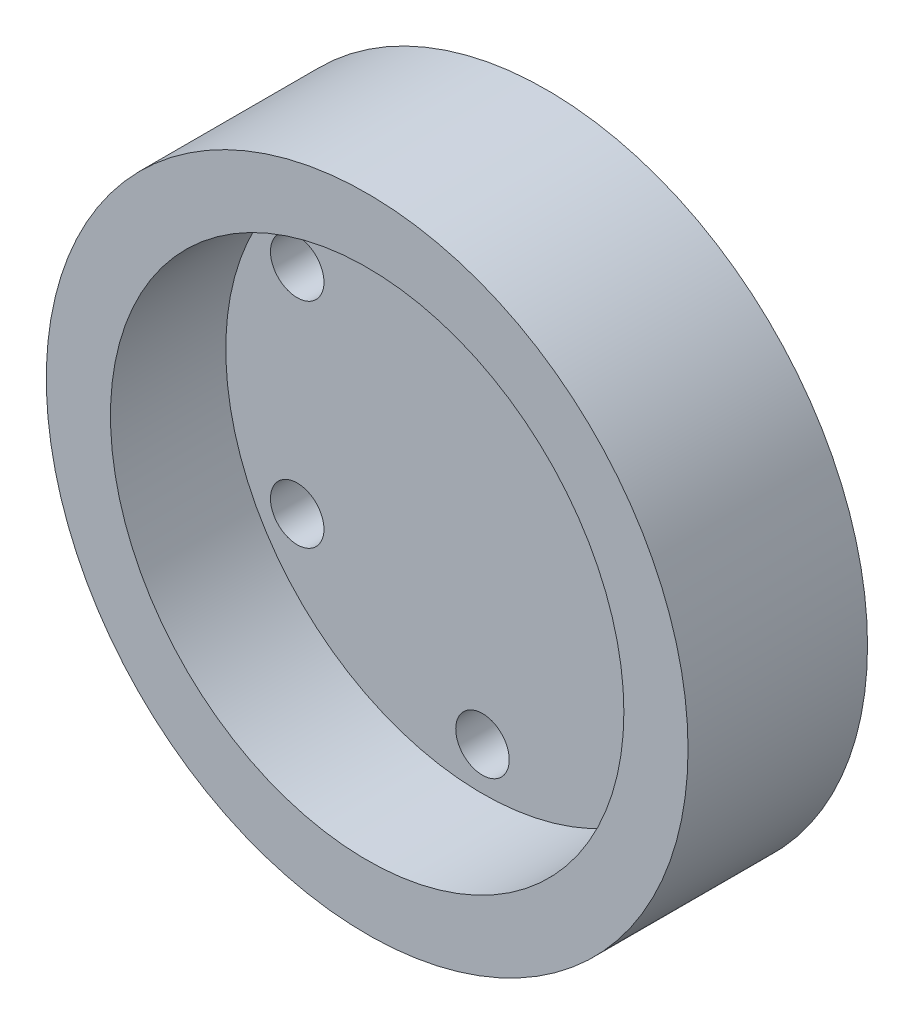
ISO-10303-21;
HEADER;
FILE_DESCRIPTION(('STEP AP214'),'2;1');
FILE_NAME('part.step','',(''),(''),'','','');
FILE_SCHEMA(('AUTOMOTIVE_DESIGN { 1 0 10303 214 1 1 1 1 }'));
ENDSEC;
DATA;
#1=APPLICATION_CONTEXT('core data for automotive mechanical design processes');
#2=APPLICATION_PROTOCOL_DEFINITION('international standard','automotive_design',2000,#1);
#3=PRODUCT_CONTEXT('',#1,'mechanical');
#4=PRODUCT('Part','Part','',(#3));
#5=PRODUCT_RELATED_PRODUCT_CATEGORY('part','',(#4));
#6=PRODUCT_DEFINITION_FORMATION('','',#4);
#7=PRODUCT_DEFINITION_CONTEXT('part definition',#1,'design');
#8=PRODUCT_DEFINITION('design','',#6,#7);
#9=PRODUCT_DEFINITION_SHAPE('','',#8);
#10=(LENGTH_UNIT() NAMED_UNIT(*) SI_UNIT(.MILLI.,.METRE.));
#11=(NAMED_UNIT(*) PLANE_ANGLE_UNIT() SI_UNIT($,.RADIAN.));
#12=(NAMED_UNIT(*) SI_UNIT($,.STERADIAN.) SOLID_ANGLE_UNIT());
#13=UNCERTAINTY_MEASURE_WITH_UNIT(LENGTH_MEASURE(1.E-05),#10,'distance_accuracy_value','');
#14=(GEOMETRIC_REPRESENTATION_CONTEXT(3) GLOBAL_UNCERTAINTY_ASSIGNED_CONTEXT((#13)) GLOBAL_UNIT_ASSIGNED_CONTEXT((#10,
#11,#12)) REPRESENTATION_CONTEXT('',''));
#15=CARTESIAN_POINT('',(0.,0.,0.));
#16=DIRECTION('',(0.,0.,1.));
#17=DIRECTION('',(1.,0.,0.));
#18=AXIS2_PLACEMENT_3D('',#15,#16,#17);
#19=CARTESIAN_POINT('',(0.,0.,5.79020268305852));
#20=DIRECTION('',(0.,0.,-1.));
#21=DIRECTION('',(-1.,0.,0.));
#22=AXIS2_PLACEMENT_3D('',#19,#20,#21);
#23=CYLINDRICAL_SURFACE('',#22,7.5);
#24=CARTESIAN_POINT('',(0.,0.,5.79020268305852));
#25=DIRECTION('',(0.,0.,1.));
#26=DIRECTION('',(1.,0.,0.));
#27=AXIS2_PLACEMENT_3D('',#24,#25,#26);
#28=CIRCLE('',#27,7.5);
#29=CARTESIAN_POINT('',(7.5,0.,5.79020268305852));
#30=VERTEX_POINT('',#29);
#31=EDGE_CURVE('E11',#30,#30,#28,.T.);
#32=ORIENTED_EDGE('',*,*,#31,.F.);
#33=EDGE_LOOP('',(#32));
#34=FACE_BOUND('',#33,.T.);
#35=CARTESIAN_POINT('',(0.,0.,1.59520268305852));
#36=DIRECTION('',(0.,0.,1.));
#37=DIRECTION('',(1.,0.,0.));
#38=AXIS2_PLACEMENT_3D('',#35,#36,#37);
#39=CIRCLE('',#38,7.5);
#40=CARTESIAN_POINT('',(7.5,0.,1.59520268305852));
#41=VERTEX_POINT('',#40);
#42=EDGE_CURVE('E51',#41,#41,#39,.T.);
#43=ORIENTED_EDGE('',*,*,#42,.T.);
#44=EDGE_LOOP('',(#43));
#45=FACE_BOUND('',#44,.T.);
#46=ADVANCED_FACE('F43',(#34,#45),#23,.T.);
#47=CARTESIAN_POINT('',(0.,0.,5.79020268305852));
#48=DIRECTION('',(0.,0.,1.));
#49=DIRECTION('',(1.,0.,0.));
#50=AXIS2_PLACEMENT_3D('',#47,#48,#49);
#51=PLANE('',#50);
#52=CARTESIAN_POINT('',(0.,0.,5.79020268305852));
#53=DIRECTION('',(0.,0.,1.));
#54=DIRECTION('',(1.,0.,0.));
#55=AXIS2_PLACEMENT_3D('',#52,#53,#54);
#56=CIRCLE('',#55,6.);
#57=CARTESIAN_POINT('',(6.,0.,5.79020268305852));
#58=VERTEX_POINT('',#57);
#59=EDGE_CURVE('E57',#58,#58,#56,.T.);
#60=ORIENTED_EDGE('',*,*,#59,.F.);
#61=EDGE_LOOP('',(#60));
#62=FACE_BOUND('',#61,.T.);
#63=ORIENTED_EDGE('',*,*,#31,.T.);
#64=EDGE_LOOP('',(#63));
#65=FACE_BOUND('',#64,.T.);
#66=ADVANCED_FACE('F125',(#62,#65),#51,.T.);
#67=CARTESIAN_POINT('',(0.,0.,1.59520268305852));
#68=DIRECTION('',(0.,0.,1.));
#69=DIRECTION('',(1.,0.,0.));
#70=AXIS2_PLACEMENT_3D('',#67,#68,#69);
#71=PLANE('',#70);
#72=CARTESIAN_POINT('',(0.,5.,1.59520268305852));
#73=DIRECTION('',(0.,0.,-1.));
#74=DIRECTION('',(-1.,0.,0.));
#75=AXIS2_PLACEMENT_3D('',#72,#73,#74);
#76=CIRCLE('',#75,0.625);
#77=CARTESIAN_POINT('',(-0.625,5.,1.59520268305852));
#78=VERTEX_POINT('',#77);
#79=EDGE_CURVE('E67',#78,#78,#76,.T.);
#80=ORIENTED_EDGE('',*,*,#79,.F.);
#81=EDGE_LOOP('',(#80));
#82=FACE_BOUND('',#81,.T.);
#83=CARTESIAN_POINT('',(4.33012701892216,2.50000000000005,1.59520268305852));
#84=DIRECTION('',(0.,0.,-1.));
#85=DIRECTION('',(-1.,0.,0.));
#86=AXIS2_PLACEMENT_3D('',#83,#84,#85);
#87=CIRCLE('',#86,0.625);
#88=CARTESIAN_POINT('',(3.70512701892216,2.50000000000005,1.59520268305852));
#89=VERTEX_POINT('',#88);
#90=EDGE_CURVE('E100',#89,#89,#87,.T.);
#91=ORIENTED_EDGE('',*,*,#90,.F.);
#92=EDGE_LOOP('',(#91));
#93=FACE_BOUND('',#92,.T.);
#94=CARTESIAN_POINT('',(4.33012701892221,-2.49999999999996,1.59520268305852));
#95=DIRECTION('',(0.,0.,-1.));
#96=DIRECTION('',(-1.,0.,0.));
#97=AXIS2_PLACEMENT_3D('',#94,#95,#96);
#98=CIRCLE('',#97,0.625);
#99=CARTESIAN_POINT('',(3.70512701892222,-2.49999999999996,1.59520268305852));
#100=VERTEX_POINT('',#99);
#101=EDGE_CURVE('E95',#100,#100,#98,.T.);
#102=ORIENTED_EDGE('',*,*,#101,.F.);
#103=EDGE_LOOP('',(#102));
#104=FACE_BOUND('',#103,.T.);
#105=CARTESIAN_POINT('',(0.,-5.,1.59520268305852));
#106=DIRECTION('',(0.,0.,-1.));
#107=DIRECTION('',(-1.,0.,0.));
#108=AXIS2_PLACEMENT_3D('',#105,#106,#107);
#109=CIRCLE('',#108,0.625);
#110=CARTESIAN_POINT('',(-0.624999999999965,-5.,1.59520268305852));
#111=VERTEX_POINT('',#110);
#112=EDGE_CURVE('E99',#111,#111,#109,.T.);
#113=ORIENTED_EDGE('',*,*,#112,.F.);
#114=EDGE_LOOP('',(#113));
#115=FACE_BOUND('',#114,.T.);
#116=CARTESIAN_POINT('',(-4.33012701892218,-2.50000000000002,1.59520268305852));
#117=DIRECTION('',(0.,0.,-1.));
#118=DIRECTION('',(-1.,0.,0.));
#119=AXIS2_PLACEMENT_3D('',#116,#117,#118);
#120=CIRCLE('',#119,0.625000000000001);
#121=CARTESIAN_POINT('',(-4.95512701892218,-2.50000000000002,1.59520268305852));
#122=VERTEX_POINT('',#121);
#123=EDGE_CURVE('E104',#122,#122,#120,.T.);
#124=ORIENTED_EDGE('',*,*,#123,.F.);
#125=EDGE_LOOP('',(#124));
#126=FACE_BOUND('',#125,.T.);
#127=CARTESIAN_POINT('',(-4.3301270189222,2.49999999999999,1.59520268305852));
#128=DIRECTION('',(0.,0.,-1.));
#129=DIRECTION('',(-1.,0.,0.));
#130=AXIS2_PLACEMENT_3D('',#127,#128,#129);
#131=CIRCLE('',#130,0.625);
#132=CARTESIAN_POINT('',(-4.9551270189222,2.49999999999999,1.59520268305852));
#133=VERTEX_POINT('',#132);
#134=EDGE_CURVE('E108',#133,#133,#131,.T.);
#135=ORIENTED_EDGE('',*,*,#134,.F.);
#136=EDGE_LOOP('',(#135));
#137=FACE_BOUND('',#136,.T.);
#138=ORIENTED_EDGE('',*,*,#42,.F.);
#139=EDGE_LOOP('',(#138));
#140=FACE_BOUND('',#139,.T.);
#141=ADVANCED_FACE('F121',(#82,#93,#104,#115,#126,#137,#140),#71,.F.);
#142=CARTESIAN_POINT('',(0.,0.,5.79020268305852));
#143=DIRECTION('',(0.,0.,-1.));
#144=DIRECTION('',(-1.,0.,0.));
#145=AXIS2_PLACEMENT_3D('',#142,#143,#144);
#146=CYLINDRICAL_SURFACE('',#145,6.);
#147=ORIENTED_EDGE('',*,*,#59,.T.);
#148=EDGE_LOOP('',(#147));
#149=FACE_BOUND('',#148,.T.);
#150=CARTESIAN_POINT('',(0.,0.,3.09520268305852));
#151=DIRECTION('',(0.,0.,1.));
#152=DIRECTION('',(1.,0.,0.));
#153=AXIS2_PLACEMENT_3D('',#150,#151,#152);
#154=CIRCLE('',#153,6.);
#155=CARTESIAN_POINT('',(6.,0.,3.09520268305852));
#156=VERTEX_POINT('',#155);
#157=EDGE_CURVE('E85',#156,#156,#154,.T.);
#158=ORIENTED_EDGE('',*,*,#157,.F.);
#159=EDGE_LOOP('',(#158));
#160=FACE_BOUND('',#159,.T.);
#161=ADVANCED_FACE('F124',(#149,#160),#146,.F.);
#162=CARTESIAN_POINT('',(0.,0.,3.09520268305852));
#163=DIRECTION('',(0.,0.,1.));
#164=DIRECTION('',(1.,0.,0.));
#165=AXIS2_PLACEMENT_3D('',#162,#163,#164);
#166=PLANE('',#165);
#167=CARTESIAN_POINT('',(0.,5.,3.09520268305852));
#168=DIRECTION('',(0.,0.,1.));
#169=DIRECTION('',(1.,0.,0.));
#170=AXIS2_PLACEMENT_3D('',#167,#168,#169);
#171=CIRCLE('',#170,0.625);
#172=CARTESIAN_POINT('',(0.625,5.,3.09520268305852));
#173=VERTEX_POINT('',#172);
#174=EDGE_CURVE('E46',#173,#173,#171,.T.);
#175=ORIENTED_EDGE('',*,*,#174,.F.);
#176=EDGE_LOOP('',(#175));
#177=FACE_BOUND('',#176,.T.);
#178=CARTESIAN_POINT('',(4.33012701892216,2.50000000000005,3.09520268305852));
#179=DIRECTION('',(0.,0.,1.));
#180=DIRECTION('',(1.,0.,0.));
#181=AXIS2_PLACEMENT_3D('',#178,#179,#180);
#182=CIRCLE('',#181,0.625);
#183=CARTESIAN_POINT('',(4.95512701892217,2.50000000000005,3.09520268305852));
#184=VERTEX_POINT('',#183);
#185=EDGE_CURVE('E78',#184,#184,#182,.T.);
#186=ORIENTED_EDGE('',*,*,#185,.F.);
#187=EDGE_LOOP('',(#186));
#188=FACE_BOUND('',#187,.T.);
#189=CARTESIAN_POINT('',(4.33012701892221,-2.49999999999996,3.09520268305852));
#190=DIRECTION('',(0.,0.,1.));
#191=DIRECTION('',(1.,0.,0.));
#192=AXIS2_PLACEMENT_3D('',#189,#190,#191);
#193=CIRCLE('',#192,0.625);
#194=CARTESIAN_POINT('',(4.95512701892221,-2.49999999999996,3.09520268305852));
#195=VERTEX_POINT('',#194);
#196=EDGE_CURVE('E75',#195,#195,#193,.T.);
#197=ORIENTED_EDGE('',*,*,#196,.F.);
#198=EDGE_LOOP('',(#197));
#199=FACE_BOUND('',#198,.T.);
#200=CARTESIAN_POINT('',(0.,-5.,3.09520268305852));
#201=DIRECTION('',(0.,0.,1.));
#202=DIRECTION('',(1.,0.,0.));
#203=AXIS2_PLACEMENT_3D('',#200,#201,#202);
#204=CIRCLE('',#203,0.625);
#205=CARTESIAN_POINT('',(0.625000000000035,-5.,3.09520268305852));
#206=VERTEX_POINT('',#205);
#207=EDGE_CURVE('E71',#206,#206,#204,.T.);
#208=ORIENTED_EDGE('',*,*,#207,.F.);
#209=EDGE_LOOP('',(#208));
#210=FACE_BOUND('',#209,.T.);
#211=CARTESIAN_POINT('',(-4.33012701892218,-2.50000000000002,3.09520268305852));
#212=DIRECTION('',(0.,0.,1.));
#213=DIRECTION('',(1.,0.,0.));
#214=AXIS2_PLACEMENT_3D('',#211,#212,#213);
#215=CIRCLE('',#214,0.625000000000001);
#216=CARTESIAN_POINT('',(-3.70512701892218,-2.50000000000002,3.09520268305852));
#217=VERTEX_POINT('',#216);
#218=EDGE_CURVE('E66',#217,#217,#215,.T.);
#219=ORIENTED_EDGE('',*,*,#218,.F.);
#220=EDGE_LOOP('',(#219));
#221=FACE_BOUND('',#220,.T.);
#222=CARTESIAN_POINT('',(-4.3301270189222,2.49999999999999,3.09520268305852));
#223=DIRECTION('',(0.,0.,1.));
#224=DIRECTION('',(1.,0.,0.));
#225=AXIS2_PLACEMENT_3D('',#222,#223,#224);
#226=CIRCLE('',#225,0.625);
#227=CARTESIAN_POINT('',(-3.7051270189222,2.49999999999999,3.09520268305852));
#228=VERTEX_POINT('',#227);
#229=EDGE_CURVE('E62',#228,#228,#226,.T.);
#230=ORIENTED_EDGE('',*,*,#229,.F.);
#231=EDGE_LOOP('',(#230));
#232=FACE_BOUND('',#231,.T.);
#233=ORIENTED_EDGE('',*,*,#157,.T.);
#234=EDGE_LOOP('',(#233));
#235=FACE_BOUND('',#234,.T.);
#236=ADVANCED_FACE('F149',(#177,#188,#199,#210,#221,#232,#235),#166,.T.);
#237=CARTESIAN_POINT('',(-4.3301270189222,2.49999999999999,4.09520268305852));
#238=DIRECTION('',(0.,0.,-1.));
#239=DIRECTION('',(-1.,0.,0.));
#240=AXIS2_PLACEMENT_3D('',#237,#238,#239);
#241=CYLINDRICAL_SURFACE('',#240,0.625);
#242=ORIENTED_EDGE('',*,*,#229,.T.);
#243=EDGE_LOOP('',(#242));
#244=FACE_BOUND('',#243,.T.);
#245=ORIENTED_EDGE('',*,*,#134,.T.);
#246=EDGE_LOOP('',(#245));
#247=FACE_BOUND('',#246,.T.);
#248=ADVANCED_FACE('F152',(#244,#247),#241,.F.);
#249=CARTESIAN_POINT('',(-4.33012701892218,-2.50000000000002,4.09520268305852));
#250=DIRECTION('',(0.,0.,-1.));
#251=DIRECTION('',(-1.,0.,0.));
#252=AXIS2_PLACEMENT_3D('',#249,#250,#251);
#253=CYLINDRICAL_SURFACE('',#252,0.625000000000001);
#254=ORIENTED_EDGE('',*,*,#218,.T.);
#255=EDGE_LOOP('',(#254));
#256=FACE_BOUND('',#255,.T.);
#257=ORIENTED_EDGE('',*,*,#123,.T.);
#258=EDGE_LOOP('',(#257));
#259=FACE_BOUND('',#258,.T.);
#260=ADVANCED_FACE('F165',(#256,#259),#253,.F.);
#261=CARTESIAN_POINT('',(0.,-5.,4.09520268305852));
#262=DIRECTION('',(0.,0.,-1.));
#263=DIRECTION('',(-1.,0.,0.));
#264=AXIS2_PLACEMENT_3D('',#261,#262,#263);
#265=CYLINDRICAL_SURFACE('',#264,0.625);
#266=ORIENTED_EDGE('',*,*,#207,.T.);
#267=EDGE_LOOP('',(#266));
#268=FACE_BOUND('',#267,.T.);
#269=ORIENTED_EDGE('',*,*,#112,.T.);
#270=EDGE_LOOP('',(#269));
#271=FACE_BOUND('',#270,.T.);
#272=ADVANCED_FACE('F161',(#268,#271),#265,.F.);
#273=CARTESIAN_POINT('',(4.33012701892221,-2.49999999999996,4.09520268305852));
#274=DIRECTION('',(0.,0.,-1.));
#275=DIRECTION('',(-1.,0.,0.));
#276=AXIS2_PLACEMENT_3D('',#273,#274,#275);
#277=CYLINDRICAL_SURFACE('',#276,0.625);
#278=ORIENTED_EDGE('',*,*,#196,.T.);
#279=EDGE_LOOP('',(#278));
#280=FACE_BOUND('',#279,.T.);
#281=ORIENTED_EDGE('',*,*,#101,.T.);
#282=EDGE_LOOP('',(#281));
#283=FACE_BOUND('',#282,.T.);
#284=ADVANCED_FACE('F157',(#280,#283),#277,.F.);
#285=CARTESIAN_POINT('',(4.33012701892216,2.50000000000005,4.09520268305852));
#286=DIRECTION('',(0.,0.,-1.));
#287=DIRECTION('',(-1.,0.,0.));
#288=AXIS2_PLACEMENT_3D('',#285,#286,#287);
#289=CYLINDRICAL_SURFACE('',#288,0.625);
#290=ORIENTED_EDGE('',*,*,#185,.T.);
#291=EDGE_LOOP('',(#290));
#292=FACE_BOUND('',#291,.T.);
#293=ORIENTED_EDGE('',*,*,#90,.T.);
#294=EDGE_LOOP('',(#293));
#295=FACE_BOUND('',#294,.T.);
#296=ADVANCED_FACE('F160',(#292,#295),#289,.F.);
#297=CARTESIAN_POINT('',(0.,5.,4.09520268305852));
#298=DIRECTION('',(0.,0.,-1.));
#299=DIRECTION('',(-1.,0.,0.));
#300=AXIS2_PLACEMENT_3D('',#297,#298,#299);
#301=CYLINDRICAL_SURFACE('',#300,0.625);
#302=ORIENTED_EDGE('',*,*,#174,.T.);
#303=EDGE_LOOP('',(#302));
#304=FACE_BOUND('',#303,.T.);
#305=ORIENTED_EDGE('',*,*,#79,.T.);
#306=EDGE_LOOP('',(#305));
#307=FACE_BOUND('',#306,.T.);
#308=ADVANCED_FACE('F119',(#304,#307),#301,.F.);
#309=CLOSED_SHELL('',(#46,#66,#141,#161,#236,#248,#260,#272,#284,#296,#308));
#310=MANIFOLD_SOLID_BREP('B2',#309);
#311=ADVANCED_BREP_SHAPE_REPRESENTATION('',(#18,#310),#14);
#312=SHAPE_DEFINITION_REPRESENTATION(#9,#311);
ENDSEC;
END-ISO-10303-21;
